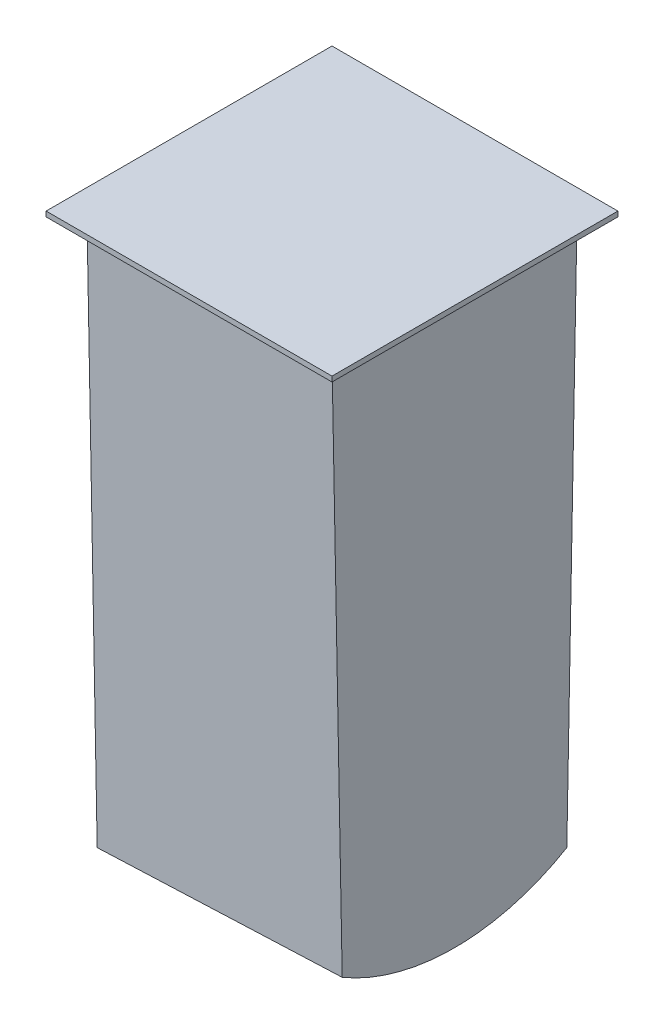
ISO-10303-21;
HEADER;
FILE_DESCRIPTION(('STEP AP214'),'2;1');
FILE_NAME('part.step','',(''),(''),'','','');
FILE_SCHEMA(('AUTOMOTIVE_DESIGN { 1 0 10303 214 1 1 1 1 }'));
ENDSEC;
DATA;
#1=APPLICATION_CONTEXT('core data for automotive mechanical design processes');
#2=APPLICATION_PROTOCOL_DEFINITION('international standard','automotive_design',2000,#1);
#3=PRODUCT_CONTEXT('',#1,'mechanical');
#4=PRODUCT('Part','Part','',(#3));
#5=PRODUCT_RELATED_PRODUCT_CATEGORY('part','',(#4));
#6=PRODUCT_DEFINITION_FORMATION('','',#4);
#7=PRODUCT_DEFINITION_CONTEXT('part definition',#1,'design');
#8=PRODUCT_DEFINITION('design','',#6,#7);
#9=PRODUCT_DEFINITION_SHAPE('','',#8);
#10=(LENGTH_UNIT() NAMED_UNIT(*) SI_UNIT(.MILLI.,.METRE.));
#11=(NAMED_UNIT(*) PLANE_ANGLE_UNIT() SI_UNIT($,.RADIAN.));
#12=(NAMED_UNIT(*) SI_UNIT($,.STERADIAN.) SOLID_ANGLE_UNIT());
#13=UNCERTAINTY_MEASURE_WITH_UNIT(LENGTH_MEASURE(1.E-05),#10,'distance_accuracy_value','');
#14=(GEOMETRIC_REPRESENTATION_CONTEXT(3) GLOBAL_UNCERTAINTY_ASSIGNED_CONTEXT((#13)) GLOBAL_UNIT_ASSIGNED_CONTEXT((#10,
#11,#12)) REPRESENTATION_CONTEXT('',''));
#15=CARTESIAN_POINT('',(0.,0.,0.));
#16=DIRECTION('',(0.,0.,1.));
#17=DIRECTION('',(1.,0.,0.));
#18=AXIS2_PLACEMENT_3D('',#15,#16,#17);
#19=CARTESIAN_POINT('',(304.8,256.611237968014,-488.316339837952));
#20=DIRECTION('',(-1.,0.,0.));
#21=DIRECTION('',(0.,0.,1.));
#22=AXIS2_PLACEMENT_3D('',#19,#20,#21);
#23=PLANE('',#22);
#24=DIRECTION('',(0.,-0.999822048223522,-0.0188645669476137));
#25=VECTOR('',#24,1.);
#26=CARTESIAN_POINT('',(304.8,692.644571301347,-335.916339837952));
#27=LINE('',#26,#25);
#28=CARTESIAN_POINT('',(304.8,692.644571301347,-335.916339837952));
#29=VERTEX_POINT('',#28);
#30=CARTESIAN_POINT('',(304.8,19.5445713013473,-348.616339837952));
#31=VERTEX_POINT('',#30);
#32=EDGE_CURVE('E64',#29,#31,#27,.T.);
#33=ORIENTED_EDGE('',*,*,#32,.T.);
#34=CARTESIAN_POINT('',(304.8,256.611237968014,-488.316339837952));
#35=DIRECTION('',(1.,0.,0.));
#36=DIRECTION('',(0.,0.,1.));
#37=AXIS2_PLACEMENT_3D('',#34,#35,#36);
#38=CIRCLE('',#37,275.166666666666);
#39=CARTESIAN_POINT('',(304.8,19.5445713013473,-628.016339837952));
#40=VERTEX_POINT('',#39);
#41=EDGE_CURVE('E190',#31,#40,#38,.T.);
#42=ORIENTED_EDGE('',*,*,#41,.T.);
#43=DIRECTION('',(0.,0.999822048223522,-0.0188645669476137));
#44=VECTOR('',#43,1.);
#45=CARTESIAN_POINT('',(304.8,19.5445713013472,-628.016339837952));
#46=LINE('',#45,#44);
#47=CARTESIAN_POINT('',(304.8,692.644571301347,-640.716339837952));
#48=VERTEX_POINT('',#47);
#49=EDGE_CURVE('E96',#40,#48,#46,.T.);
#50=ORIENTED_EDGE('',*,*,#49,.T.);
#51=DIRECTION('',(0.,0.,1.));
#52=VECTOR('',#51,1.);
#53=CARTESIAN_POINT('',(304.8,692.644571301347,-640.716339837952));
#54=LINE('',#53,#52);
#55=EDGE_CURVE('E137',#48,#29,#54,.T.);
#56=ORIENTED_EDGE('',*,*,#55,.T.);
#57=EDGE_LOOP('',(#33,#42,#50,#56));
#58=FACE_BOUND('',#57,.T.);
#59=ADVANCED_FACE('F60',(#58),#23,.F.);
#60=CARTESIAN_POINT('',(0.,173.532071301347,-488.312288406467));
#61=DIRECTION('',(-1.,0.,0.));
#62=DIRECTION('',(0.,0.,1.));
#63=AXIS2_PLACEMENT_3D('',#60,#61,#62);
#64=PLANE('',#63);
#65=DIRECTION('',(0.,-0.999828576325131,-0.0185153440060211));
#66=VECTOR('',#65,1.);
#67=CARTESIAN_POINT('',(0.,692.644571301347,-335.912288406467));
#68=LINE('',#67,#66);
#69=CARTESIAN_POINT('',(0.,692.644571301347,-335.912288406467));
#70=VERTEX_POINT('',#69);
#71=CARTESIAN_POINT('',(0.,6.84457130134727,-348.612288406467));
#72=VERTEX_POINT('',#71);
#73=EDGE_CURVE('E123',#70,#72,#68,.T.);
#74=ORIENTED_EDGE('',*,*,#73,.F.);
#75=DIRECTION('',(0.,0.,1.));
#76=VECTOR('',#75,1.);
#77=CARTESIAN_POINT('',(0.,692.644571301347,-640.712288406467));
#78=LINE('',#77,#76);
#79=CARTESIAN_POINT('',(0.,692.644571301347,-640.712288406467));
#80=VERTEX_POINT('',#79);
#81=EDGE_CURVE('E14',#80,#70,#78,.T.);
#82=ORIENTED_EDGE('',*,*,#81,.F.);
#83=DIRECTION('',(0.,0.999828576325131,-0.0185153440060208));
#84=VECTOR('',#83,1.);
#85=CARTESIAN_POINT('',(0.,6.84457130134734,-628.012288406467));
#86=LINE('',#85,#84);
#87=CARTESIAN_POINT('',(0.,6.84457130134734,-628.012288406467));
#88=VERTEX_POINT('',#87);
#89=EDGE_CURVE('E71',#88,#80,#86,.T.);
#90=ORIENTED_EDGE('',*,*,#89,.F.);
#91=CARTESIAN_POINT('',(0.,173.532071301347,-488.312288406467));
#92=DIRECTION('',(1.,0.,0.));
#93=DIRECTION('',(0.,0.,1.));
#94=AXIS2_PLACEMENT_3D('',#91,#92,#93);
#95=CIRCLE('',#94,217.4875);
#96=EDGE_CURVE('E80',#72,#88,#95,.T.);
#97=ORIENTED_EDGE('',*,*,#96,.F.);
#98=EDGE_LOOP('',(#74,#82,#90,#97));
#99=FACE_BOUND('',#98,.T.);
#100=ADVANCED_FACE('F131',(#99),#64,.T.);
#101=CARTESIAN_POINT('',(0.,6.84457130134734,-628.012288406467));
#102=CARTESIAN_POINT('',(304.8,19.5445713013472,-628.016339837952));
#103=CARTESIAN_POINT('',(0.,121.144571301348,-630.128955073133));
#104=CARTESIAN_POINT('',(304.8,131.727904634681,-630.133006504618));
#105=CARTESIAN_POINT('',(0.,235.444571301348,-632.2456217398));
#106=CARTESIAN_POINT('',(304.8,243.911237968014,-632.249673171285));
#107=CARTESIAN_POINT('',(0.,464.044571301348,-636.478955073133));
#108=CARTESIAN_POINT('',(304.8,468.277904634681,-636.483006504618));
#109=CARTESIAN_POINT('',(0.,578.344571301348,-638.5956217398));
#110=CARTESIAN_POINT('',(304.8,580.461237968014,-638.599673171285));
#111=CARTESIAN_POINT('',(0.,692.644571301348,-640.712288406467));
#112=CARTESIAN_POINT('',(304.8,692.644571301348,-640.716339837952));
#113=B_SPLINE_SURFACE_WITH_KNOTS('',3,1,((#101,#102),(#103,#104),(#105,#106),(#107,#108),(#109,
#110),(#111,#112)),.UNSPECIFIED.,.F.,.F.,.F.,(4,2,4),(2,2),(0.,0.5,1.),(0.,1.),.UNSPECIFIED.);
#114=DIRECTION('',(0.99999999991166,0.,-1.32920980466072E-05));
#115=VECTOR('',#114,1.);
#116=CARTESIAN_POINT('',(0.,692.644571301347,-640.712288406467));
#117=LINE('',#116,#115);
#118=EDGE_CURVE('E102',#80,#48,#117,.T.);
#119=DIRECTION('',(0.999133073004241,0.04163054470851,-1.32805747687896E-05));
#120=VECTOR('',#119,1.);
#121=CARTESIAN_POINT('',(152.4,13.1945713013473,-628.014314122209));
#122=LINE('',#121,#120);
#123=EDGE_CURVE('E334',#88,#40,#122,.T.);
#124=ORIENTED_EDGE('',*,*,#89,.T.);
#125=ORIENTED_EDGE('',*,*,#118,.T.);
#126=ORIENTED_EDGE('',*,*,#49,.F.);
#127=ORIENTED_EDGE('',*,*,#123,.F.);
#128=EDGE_LOOP('',(#124,#125,#126,#127));
#129=FACE_BOUND('',#128,.T.);
#130=ADVANCED_FACE('F163',(#129),#113,.T.);
#131=CARTESIAN_POINT('',(0.,692.644571301347,-335.912288406467));
#132=CARTESIAN_POINT('',(304.8,692.644571301347,-335.916339837952));
#133=CARTESIAN_POINT('',(0.,578.344571301347,-338.028955073133));
#134=CARTESIAN_POINT('',(304.8,580.461237968014,-338.033006504618));
#135=CARTESIAN_POINT('',(0.,464.044571301347,-340.1456217398));
#136=CARTESIAN_POINT('',(304.8,468.277904634681,-340.149673171285));
#137=CARTESIAN_POINT('',(0.,235.444571301347,-344.378955073133));
#138=CARTESIAN_POINT('',(304.8,243.911237968014,-344.383006504618));
#139=CARTESIAN_POINT('',(0.,121.144571301347,-346.4956217398));
#140=CARTESIAN_POINT('',(304.8,131.727904634681,-346.499673171285));
#141=CARTESIAN_POINT('',(0.,6.84457130134719,-348.612288406467));
#142=CARTESIAN_POINT('',(304.8,19.5445713013473,-348.616339837952));
#143=B_SPLINE_SURFACE_WITH_KNOTS('',3,1,((#131,#132),(#133,#134),(#135,#136),(#137,#138),(#139,
#140),(#141,#142)),.UNSPECIFIED.,.F.,.F.,.F.,(4,2,4),(2,2),(0.,0.5,1.),(0.,1.),.UNSPECIFIED.);
#144=DIRECTION('',(0.999133073004241,0.0416305447085106,-1.32805747686077E-05));
#145=VECTOR('',#144,1.);
#146=CARTESIAN_POINT('',(152.4,13.1945713013473,-348.614314122209));
#147=LINE('',#146,#145);
#148=EDGE_CURVE('E128',#72,#31,#147,.T.);
#149=DIRECTION('',(0.99999999991166,0.,-1.3292098046243E-05));
#150=VECTOR('',#149,1.);
#151=CARTESIAN_POINT('',(0.,692.644571301347,-335.912288406467));
#152=LINE('',#151,#150);
#153=EDGE_CURVE('E121',#70,#29,#152,.T.);
#154=ORIENTED_EDGE('',*,*,#73,.T.);
#155=ORIENTED_EDGE('',*,*,#148,.T.);
#156=ORIENTED_EDGE('',*,*,#32,.F.);
#157=ORIENTED_EDGE('',*,*,#153,.F.);
#158=EDGE_LOOP('',(#154,#155,#156,#157));
#159=FACE_BOUND('',#158,.T.);
#160=ADVANCED_FACE('F122',(#159),#143,.T.);
#161=CARTESIAN_POINT('',(0.,6.84457130134727,-348.612288406467));
#162=CARTESIAN_POINT('',(304.8,19.5445713013473,-348.616339837952));
#163=CARTESIAN_POINT('',(0.,3.10564186095798,-353.073511034204));
#164=CARTESIAN_POINT('',(304.8,16.589378993655,-353.631211632823));
#165=CARTESIAN_POINT('',(0.,-0.508812996061868,-357.750428566769));
#166=CARTESIAN_POINT('',(304.8,13.7680463707759,-358.784048773531));
#167=CARTESIAN_POINT('',(0.,-7.42540275021168,-367.518988771493));
#168=CARTESIAN_POINT('',(304.8,8.42447103213467,-369.342551157111));
#169=CARTESIAN_POINT('',(0.,-10.7274568051616,-372.610654284179));
#170=CARTESIAN_POINT('',(304.8,5.90222831637249,-374.748216399982));
#171=CARTESIAN_POINT('',(0.,-16.9560928998361,-383.180460990293));
#172=CARTESIAN_POINT('',(304.8,1.18820332945538,-385.78927239838));
#173=CARTESIAN_POINT('',(0.,-19.8825845237936,-388.658604423465));
#174=CARTESIAN_POINT('',(304.8,-1.0033573746848,-391.424578815122));
#175=CARTESIAN_POINT('',(0.,-25.2998838754764,-399.961060798113));
#176=CARTESIAN_POINT('',(304.8,-5.02990967648332,-402.892655994594));
#177=CARTESIAN_POINT('',(0.,-27.7905977653194,-405.785351606467));
#178=CARTESIAN_POINT('',(304.8,-6.86490127414166,-408.725426757324));
#179=CARTESIAN_POINT('',(0.,-32.281859631986,-417.728025206467));
#180=CARTESIAN_POINT('',(304.8,-10.1526498351314,-420.556340139674));
#181=CARTESIAN_POINT('',(0.,-34.2823180296107,-423.846359862566));
#182=CARTESIAN_POINT('',(304.8,-11.6052230411069,-426.554308084707));
#183=CARTESIAN_POINT('',(0.,-37.7470992054229,-436.314322427042));
#184=CARTESIAN_POINT('',(304.8,-14.1108900020936,-438.676136717249));
#185=CARTESIAN_POINT('',(0.,-39.2113450069928,-442.663877361049));
#186=CARTESIAN_POINT('',(304.8,-15.1639837571047,-444.799997404758));
#187=CARTESIAN_POINT('',(0.,-41.5687746853946,-455.522584697786));
#188=CARTESIAN_POINT('',(304.8,-16.8538145142369,-457.134481757007));
#189=CARTESIAN_POINT('',(0.,-42.46190203978,-462.031643492023));
#190=CARTESIAN_POINT('',(304.8,-17.4904469049824,-463.34486288188));
#191=CARTESIAN_POINT('',(0.,-43.6552440173192,-475.131283836374));
#192=CARTESIAN_POINT('',(304.8,-18.3412539971903,-475.808897982959));
#193=CARTESIAN_POINT('',(0.,-43.9554286986527,-481.721758103436));
#194=CARTESIAN_POINT('',(304.8,-18.5554286986528,-482.062551959164));
#195=CARTESIAN_POINT('',(0.,-43.9554286986527,-494.902818709497));
#196=CARTESIAN_POINT('',(304.8,-18.5554286986528,-494.57012771674));
#197=CARTESIAN_POINT('',(0.,-43.6552440173192,-501.493292976559));
#198=CARTESIAN_POINT('',(304.8,-18.3412539971903,-500.823781692945));
#199=CARTESIAN_POINT('',(0.,-42.46190203978,-514.59293332091));
#200=CARTESIAN_POINT('',(304.8,-17.4904469049824,-513.287816794023));
#201=CARTESIAN_POINT('',(0.,-41.5687746853946,-521.101992115147));
#202=CARTESIAN_POINT('',(304.8,-16.8538145142369,-519.498197918897));
#203=CARTESIAN_POINT('',(0.,-39.2113450069928,-533.960699451885));
#204=CARTESIAN_POINT('',(304.8,-15.1639837571047,-531.832682271146));
#205=CARTESIAN_POINT('',(0.,-37.7470992054229,-540.310254385892));
#206=CARTESIAN_POINT('',(304.8,-14.1108900020936,-537.956542958654));
#207=CARTESIAN_POINT('',(0.,-34.2823180296107,-552.778216950368));
#208=CARTESIAN_POINT('',(304.8,-11.6052230411069,-550.078371591196));
#209=CARTESIAN_POINT('',(0.,-32.281859631986,-558.896551606467));
#210=CARTESIAN_POINT('',(304.8,-10.1526498351314,-556.076339536229));
#211=CARTESIAN_POINT('',(0.,-27.7905977653194,-570.839225206467));
#212=CARTESIAN_POINT('',(304.8,-6.86490127414166,-567.907252918579));
#213=CARTESIAN_POINT('',(0.,-25.2998838754764,-576.663516014821));
#214=CARTESIAN_POINT('',(304.8,-5.02990967648332,-573.740023681309));
#215=CARTESIAN_POINT('',(0.,-19.8825845237936,-587.965972389468));
#216=CARTESIAN_POINT('',(304.8,-1.0033573746848,-585.208100860781));
#217=CARTESIAN_POINT('',(0.,-16.9560928998361,-593.44411582264));
#218=CARTESIAN_POINT('',(304.8,1.18820332945538,-590.843407277523));
#219=CARTESIAN_POINT('',(0.,-10.7274568051616,-604.013922528755));
#220=CARTESIAN_POINT('',(304.8,5.90222831637249,-601.884463275921));
#221=CARTESIAN_POINT('',(0.,-7.42540275021165,-609.10558804144));
#222=CARTESIAN_POINT('',(304.8,8.42447103213467,-607.290128518793));
#223=CARTESIAN_POINT('',(0.,-0.50881299606184,-618.874148246165));
#224=CARTESIAN_POINT('',(304.8,13.7680463707759,-617.848630902372));
#225=CARTESIAN_POINT('',(0.,3.10564186095801,-623.551065778729));
#226=CARTESIAN_POINT('',(304.8,16.589378993655,-623.00146804308));
#227=CARTESIAN_POINT('',(0.,6.8445713013473,-628.012288406467));
#228=CARTESIAN_POINT('',(304.8,19.5445713013473,-628.016339837952));
#229=B_SPLINE_SURFACE_WITH_KNOTS('',3,1,((#161,#162),(#163,#164),(#165,#166),(#167,#168),(#169,
#170),(#171,#172),(#173,#174),(#175,#176),(#177,#178),(#179,#180),(#181,#182),(#183,#184),(#185,
#186),(#187,#188),(#189,#190),(#191,#192),(#193,#194),(#195,#196),(#197,#198),(#199,#200),(#201,
#202),(#203,#204),(#205,#206),(#207,#208),(#209,#210),(#211,#212),(#213,#214),(#215,#216),(#217,
#218),(#219,#220),(#221,#222),(#223,#224),(#225,#226),(#227,#228)),.UNSPECIFIED.,.F.,.F.,.F.,(4,
2,2,2,2,2,2,2,2,2,2,2,2,2,2,2,4),(2,2),(0.,0.0625,0.125,0.1875,0.25,0.3125,0.375,0.4375,0.5,
0.5625,0.625,0.6875,0.75,0.8125,0.875,0.9375,1.),(0.,1.),.UNSPECIFIED.);
#230=ORIENTED_EDGE('',*,*,#96,.T.);
#231=ORIENTED_EDGE('',*,*,#123,.T.);
#232=ORIENTED_EDGE('',*,*,#41,.F.);
#233=ORIENTED_EDGE('',*,*,#148,.F.);
#234=EDGE_LOOP('',(#230,#231,#232,#233));
#235=FACE_BOUND('',#234,.T.);
#236=ADVANCED_FACE('F162',(#235),#229,.T.);
#237=CARTESIAN_POINT('',(-25.4,698.994571301347,-666.114314122209));
#238=DIRECTION('',(1.,0.,0.));
#239=DIRECTION('',(0.,1.,0.));
#240=AXIS2_PLACEMENT_3D('',#237,#238,#239);
#241=PLANE('',#240);
#242=DIRECTION('',(0.,0.,1.));
#243=VECTOR('',#242,1.);
#244=CARTESIAN_POINT('',(-25.4,692.644571301347,-666.114314122209));
#245=LINE('',#244,#243);
#246=CARTESIAN_POINT('',(-25.4,692.644571301347,-666.114314122209));
#247=VERTEX_POINT('',#246);
#248=CARTESIAN_POINT('',(-25.4,692.644571301347,-310.514314122209));
#249=VERTEX_POINT('',#248);
#250=EDGE_CURVE('E278',#247,#249,#245,.T.);
#251=ORIENTED_EDGE('',*,*,#250,.T.);
#252=DIRECTION('',(0.,-1.,0.));
#253=VECTOR('',#252,1.);
#254=CARTESIAN_POINT('',(-25.4,698.994571301347,-310.514314122209));
#255=LINE('',#254,#253);
#256=CARTESIAN_POINT('',(-25.4,698.994571301347,-310.514314122209));
#257=VERTEX_POINT('',#256);
#258=EDGE_CURVE('E141',#257,#249,#255,.T.);
#259=ORIENTED_EDGE('',*,*,#258,.F.);
#260=DIRECTION('',(0.,0.,1.));
#261=VECTOR('',#260,1.);
#262=CARTESIAN_POINT('',(-25.4,698.994571301347,-666.114314122209));
#263=LINE('',#262,#261);
#264=CARTESIAN_POINT('',(-25.4,698.994571301347,-666.114314122209));
#265=VERTEX_POINT('',#264);
#266=EDGE_CURVE('E273',#265,#257,#263,.T.);
#267=ORIENTED_EDGE('',*,*,#266,.F.);
#268=DIRECTION('',(0.,-1.,0.));
#269=VECTOR('',#268,1.);
#270=CARTESIAN_POINT('',(-25.4,698.994571301347,-666.114314122209));
#271=LINE('',#270,#269);
#272=EDGE_CURVE('E264',#265,#247,#271,.T.);
#273=ORIENTED_EDGE('',*,*,#272,.T.);
#274=EDGE_LOOP('',(#251,#259,#267,#273));
#275=FACE_BOUND('',#274,.T.);
#276=ADVANCED_FACE('F297',(#275),#241,.F.);
#277=CARTESIAN_POINT('',(-25.4,698.994571301347,-310.514314122209));
#278=DIRECTION('',(0.,0.,-1.));
#279=DIRECTION('',(0.,1.,0.));
#280=AXIS2_PLACEMENT_3D('',#277,#278,#279);
#281=PLANE('',#280);
#282=DIRECTION('',(1.,0.,0.));
#283=VECTOR('',#282,1.);
#284=CARTESIAN_POINT('',(-25.4,692.644571301347,-310.514314122209));
#285=LINE('',#284,#283);
#286=CARTESIAN_POINT('',(330.2,692.644571301347,-310.514314122209));
#287=VERTEX_POINT('',#286);
#288=EDGE_CURVE('E276',#249,#287,#285,.T.);
#289=ORIENTED_EDGE('',*,*,#288,.T.);
#290=DIRECTION('',(0.,-1.,0.));
#291=VECTOR('',#290,1.);
#292=CARTESIAN_POINT('',(330.2,698.994571301347,-310.514314122209));
#293=LINE('',#292,#291);
#294=CARTESIAN_POINT('',(330.2,698.994571301347,-310.514314122209));
#295=VERTEX_POINT('',#294);
#296=EDGE_CURVE('E248',#295,#287,#293,.T.);
#297=ORIENTED_EDGE('',*,*,#296,.F.);
#298=DIRECTION('',(1.,0.,0.));
#299=VECTOR('',#298,1.);
#300=CARTESIAN_POINT('',(-25.4,698.994571301347,-310.514314122209));
#301=LINE('',#300,#299);
#302=EDGE_CURVE('E284',#257,#295,#301,.T.);
#303=ORIENTED_EDGE('',*,*,#302,.F.);
#304=ORIENTED_EDGE('',*,*,#258,.T.);
#305=EDGE_LOOP('',(#289,#297,#303,#304));
#306=FACE_BOUND('',#305,.T.);
#307=ADVANCED_FACE('F317',(#306),#281,.F.);
#308=CARTESIAN_POINT('',(330.2,698.994571301347,-666.114314122209));
#309=DIRECTION('',(-1.,0.,0.));
#310=DIRECTION('',(0.,-1.,0.));
#311=AXIS2_PLACEMENT_3D('',#308,#309,#310);
#312=PLANE('',#311);
#313=DIRECTION('',(0.,0.,-1.));
#314=VECTOR('',#313,1.);
#315=CARTESIAN_POINT('',(330.2,692.644571301347,-666.114314122209));
#316=LINE('',#315,#314);
#317=CARTESIAN_POINT('',(330.2,692.644571301347,-666.114314122209));
#318=VERTEX_POINT('',#317);
#319=EDGE_CURVE('E274',#287,#318,#316,.T.);
#320=ORIENTED_EDGE('',*,*,#319,.T.);
#321=DIRECTION('',(0.,-1.,0.));
#322=VECTOR('',#321,1.);
#323=CARTESIAN_POINT('',(330.2,698.994571301347,-666.114314122209));
#324=LINE('',#323,#322);
#325=CARTESIAN_POINT('',(330.2,698.994571301347,-666.114314122209));
#326=VERTEX_POINT('',#325);
#327=EDGE_CURVE('E256',#326,#318,#324,.T.);
#328=ORIENTED_EDGE('',*,*,#327,.F.);
#329=DIRECTION('',(0.,0.,-1.));
#330=VECTOR('',#329,1.);
#331=CARTESIAN_POINT('',(330.2,698.994571301347,-666.114314122209));
#332=LINE('',#331,#330);
#333=EDGE_CURVE('E281',#295,#326,#332,.T.);
#334=ORIENTED_EDGE('',*,*,#333,.F.);
#335=ORIENTED_EDGE('',*,*,#296,.T.);
#336=EDGE_LOOP('',(#320,#328,#334,#335));
#337=FACE_BOUND('',#336,.T.);
#338=ADVANCED_FACE('F308',(#337),#312,.F.);
#339=CARTESIAN_POINT('',(-25.4,698.994571301347,-666.114314122209));
#340=DIRECTION('',(0.,0.,1.));
#341=DIRECTION('',(0.,-1.,0.));
#342=AXIS2_PLACEMENT_3D('',#339,#340,#341);
#343=PLANE('',#342);
#344=DIRECTION('',(-1.,0.,0.));
#345=VECTOR('',#344,1.);
#346=CARTESIAN_POINT('',(-25.4,692.644571301347,-666.114314122209));
#347=LINE('',#346,#345);
#348=EDGE_CURVE('E270',#318,#247,#347,.T.);
#349=ORIENTED_EDGE('',*,*,#348,.T.);
#350=ORIENTED_EDGE('',*,*,#272,.F.);
#351=DIRECTION('',(-1.,0.,0.));
#352=VECTOR('',#351,1.);
#353=CARTESIAN_POINT('',(-25.4,698.994571301347,-666.114314122209));
#354=LINE('',#353,#352);
#355=EDGE_CURVE('E269',#326,#265,#354,.T.);
#356=ORIENTED_EDGE('',*,*,#355,.F.);
#357=ORIENTED_EDGE('',*,*,#327,.T.);
#358=EDGE_LOOP('',(#349,#350,#356,#357));
#359=FACE_BOUND('',#358,.T.);
#360=ADVANCED_FACE('F309',(#359),#343,.F.);
#361=CARTESIAN_POINT('',(-25.4,698.994571301347,-310.514314122209));
#362=DIRECTION('',(0.,1.,0.));
#363=DIRECTION('',(0.,0.,1.));
#364=AXIS2_PLACEMENT_3D('',#361,#362,#363);
#365=PLANE('',#364);
#366=ORIENTED_EDGE('',*,*,#266,.T.);
#367=ORIENTED_EDGE('',*,*,#302,.T.);
#368=ORIENTED_EDGE('',*,*,#333,.T.);
#369=ORIENTED_EDGE('',*,*,#355,.T.);
#370=EDGE_LOOP('',(#366,#367,#368,#369));
#371=FACE_BOUND('',#370,.T.);
#372=ADVANCED_FACE('F291',(#371),#365,.T.);
#373=CARTESIAN_POINT('',(-25.4,692.644571301347,-310.514314122209));
#374=DIRECTION('',(0.,1.,0.));
#375=DIRECTION('',(0.,0.,1.));
#376=AXIS2_PLACEMENT_3D('',#373,#374,#375);
#377=PLANE('',#376);
#378=ORIENTED_EDGE('',*,*,#118,.F.);
#379=ORIENTED_EDGE('',*,*,#81,.T.);
#380=ORIENTED_EDGE('',*,*,#153,.T.);
#381=ORIENTED_EDGE('',*,*,#55,.F.);
#382=EDGE_LOOP('',(#378,#379,#380,#381));
#383=FACE_BOUND('',#382,.T.);
#384=ORIENTED_EDGE('',*,*,#250,.F.);
#385=ORIENTED_EDGE('',*,*,#348,.F.);
#386=ORIENTED_EDGE('',*,*,#319,.F.);
#387=ORIENTED_EDGE('',*,*,#288,.F.);
#388=EDGE_LOOP('',(#384,#385,#386,#387));
#389=FACE_BOUND('',#388,.T.);
#390=ADVANCED_FACE('F135',(#383,#389),#377,.F.);
#391=CLOSED_SHELL('',(#59,#100,#130,#160,#236,#276,#307,#338,#360,#372,#390));
#392=MANIFOLD_SOLID_BREP('B2',#391);
#393=ADVANCED_BREP_SHAPE_REPRESENTATION('',(#18,#392),#14);
#394=SHAPE_DEFINITION_REPRESENTATION(#9,#393);
ENDSEC;
END-ISO-10303-21;
